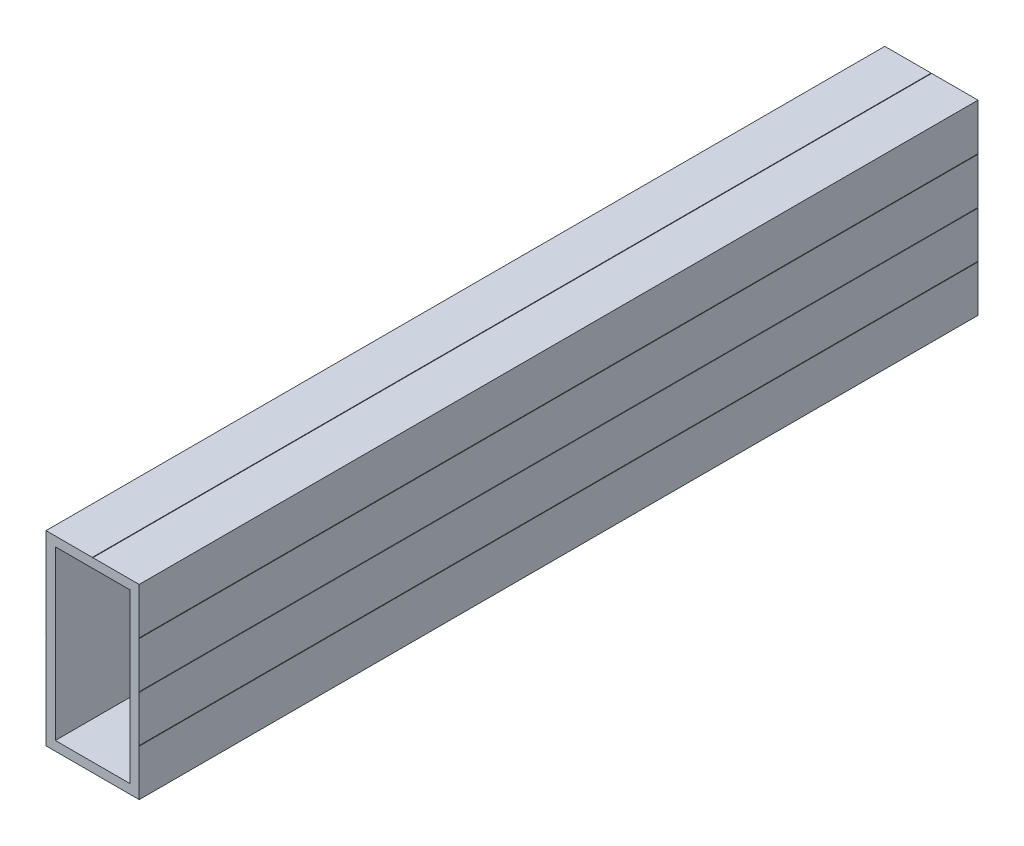
ISO-10303-21;
HEADER;
FILE_DESCRIPTION(('STEP AP214'),'2;1');
FILE_NAME('part.step','',(''),(''),'','','');
FILE_SCHEMA(('AUTOMOTIVE_DESIGN { 1 0 10303 214 1 1 1 1 }'));
ENDSEC;
DATA;
#1=APPLICATION_CONTEXT('core data for automotive mechanical design processes');
#2=APPLICATION_PROTOCOL_DEFINITION('international standard','automotive_design',2000,#1);
#3=PRODUCT_CONTEXT('',#1,'mechanical');
#4=PRODUCT('Part','Part','',(#3));
#5=PRODUCT_RELATED_PRODUCT_CATEGORY('part','',(#4));
#6=PRODUCT_DEFINITION_FORMATION('','',#4);
#7=PRODUCT_DEFINITION_CONTEXT('part definition',#1,'design');
#8=PRODUCT_DEFINITION('design','',#6,#7);
#9=PRODUCT_DEFINITION_SHAPE('','',#8);
#10=(LENGTH_UNIT() NAMED_UNIT(*) SI_UNIT(.MILLI.,.METRE.));
#11=(NAMED_UNIT(*) PLANE_ANGLE_UNIT() SI_UNIT($,.RADIAN.));
#12=(NAMED_UNIT(*) SI_UNIT($,.STERADIAN.) SOLID_ANGLE_UNIT());
#13=UNCERTAINTY_MEASURE_WITH_UNIT(LENGTH_MEASURE(1.E-05),#10,'distance_accuracy_value','');
#14=(GEOMETRIC_REPRESENTATION_CONTEXT(3) GLOBAL_UNCERTAINTY_ASSIGNED_CONTEXT((#13)) GLOBAL_UNIT_ASSIGNED_CONTEXT((#10,
#11,#12)) REPRESENTATION_CONTEXT('',''));
#15=CARTESIAN_POINT('',(0.,0.,0.));
#16=DIRECTION('',(0.,0.,1.));
#17=DIRECTION('',(1.,0.,0.));
#18=AXIS2_PLACEMENT_3D('',#15,#16,#17);
#19=CARTESIAN_POINT('',(-12.7,0.,0.));
#20=DIRECTION('',(1.,0.,0.));
#21=DIRECTION('',(0.,0.,-1.));
#22=AXIS2_PLACEMENT_3D('',#19,#20,#21);
#23=PLANE('',#22);
#24=DIRECTION('',(0.,0.,1.));
#25=VECTOR('',#24,1.);
#26=CARTESIAN_POINT('',(-12.7,25.4,-749.3));
#27=LINE('',#26,#25);
#28=CARTESIAN_POINT('',(-12.7,25.4,520.7));
#29=VERTEX_POINT('',#28);
#30=CARTESIAN_POINT('',(-12.7,25.4,749.3));
#31=VERTEX_POINT('',#30);
#32=EDGE_CURVE('E336',#29,#31,#27,.T.);
#33=ORIENTED_EDGE('',*,*,#32,.F.);
#34=DIRECTION('',(0.,-1.,0.));
#35=VECTOR('',#34,1.);
#36=CARTESIAN_POINT('',(-12.7,0.,520.7));
#37=LINE('',#36,#35);
#38=CARTESIAN_POINT('',(-12.7000000000132,12.7762,520.7));
#39=VERTEX_POINT('',#38);
#40=EDGE_CURVE('E409',#29,#39,#37,.T.);
#41=ORIENTED_EDGE('',*,*,#40,.T.);
#42=DIRECTION('',(0.,0.,1.));
#43=VECTOR('',#42,1.);
#44=CARTESIAN_POINT('',(-12.7000000000132,12.7762,-749.3));
#45=LINE('',#44,#43);
#46=CARTESIAN_POINT('',(-12.7000000000132,12.7762,749.3));
#47=VERTEX_POINT('',#46);
#48=EDGE_CURVE('E272',#39,#47,#45,.T.);
#49=ORIENTED_EDGE('',*,*,#48,.T.);
#50=DIRECTION('',(0.,-1.,0.));
#51=VECTOR('',#50,1.);
#52=CARTESIAN_POINT('',(-12.7,25.4,749.3));
#53=LINE('',#52,#51);
#54=EDGE_CURVE('E340',#31,#47,#53,.T.);
#55=ORIENTED_EDGE('',*,*,#54,.F.);
#56=EDGE_LOOP('',(#33,#41,#49,#55));
#57=FACE_BOUND('',#56,.T.);
#58=ADVANCED_FACE('F35',(#57),#23,.F.);
#59=DIRECTION('',(0.,0.,-1.));
#60=VECTOR('',#59,1.);
#61=CARTESIAN_POINT('',(-12.7,12.6238000000132,0.));
#62=LINE('',#61,#60);
#63=CARTESIAN_POINT('',(-12.7,12.6238000000132,520.7));
#64=VERTEX_POINT('',#63);
#65=CARTESIAN_POINT('',(-12.7,12.6238000000132,749.3));
#66=VERTEX_POINT('',#65);
#67=EDGE_CURVE('E274',#64,#66,#62,.F.);
#68=ORIENTED_EDGE('',*,*,#67,.F.);
#69=DIRECTION('',(0.,-1.,0.));
#70=VECTOR('',#69,1.);
#71=CARTESIAN_POINT('',(-12.7,0.,520.7));
#72=LINE('',#71,#70);
#73=CARTESIAN_POINT('',(-12.7,0.0761999999999976,520.7));
#74=VERTEX_POINT('',#73);
#75=EDGE_CURVE('E50',#64,#74,#72,.T.);
#76=ORIENTED_EDGE('',*,*,#75,.T.);
#77=DIRECTION('',(0.,0.,1.));
#78=VECTOR('',#77,1.);
#79=CARTESIAN_POINT('',(-12.7,0.0761999999999976,-749.3));
#80=LINE('',#79,#78);
#81=CARTESIAN_POINT('',(-12.7,0.0761999999999976,749.3));
#82=VERTEX_POINT('',#81);
#83=EDGE_CURVE('E280',#74,#82,#80,.T.);
#84=ORIENTED_EDGE('',*,*,#83,.T.);
#85=EDGE_CURVE('E344',#66,#82,#53,.T.);
#86=ORIENTED_EDGE('',*,*,#85,.F.);
#87=EDGE_LOOP('',(#68,#76,#84,#86));
#88=FACE_BOUND('',#87,.T.);
#89=ADVANCED_FACE('F514',(#88),#23,.F.);
#90=DIRECTION('',(0.,0.,-1.));
#91=VECTOR('',#90,1.);
#92=CARTESIAN_POINT('',(-12.7,-0.0761999999999985,0.));
#93=LINE('',#92,#91);
#94=CARTESIAN_POINT('',(-12.7,-0.0761999999999982,520.7));
#95=VERTEX_POINT('',#94);
#96=CARTESIAN_POINT('',(-12.7,-0.0761999999999985,749.3));
#97=VERTEX_POINT('',#96);
#98=EDGE_CURVE('E282',#95,#97,#93,.F.);
#99=ORIENTED_EDGE('',*,*,#98,.F.);
#100=DIRECTION('',(0.,-1.,0.));
#101=VECTOR('',#100,1.);
#102=CARTESIAN_POINT('',(-12.7,0.,520.7));
#103=LINE('',#102,#101);
#104=CARTESIAN_POINT('',(-12.7,-12.6238,520.7));
#105=VERTEX_POINT('',#104);
#106=EDGE_CURVE('E431',#95,#105,#103,.T.);
#107=ORIENTED_EDGE('',*,*,#106,.T.);
#108=DIRECTION('',(0.,0.,1.));
#109=VECTOR('',#108,1.);
#110=CARTESIAN_POINT('',(-12.7,-12.6238,-749.3));
#111=LINE('',#110,#109);
#112=CARTESIAN_POINT('',(-12.7,-12.6238,749.3));
#113=VERTEX_POINT('',#112);
#114=EDGE_CURVE('E291',#105,#113,#111,.T.);
#115=ORIENTED_EDGE('',*,*,#114,.T.);
#116=EDGE_CURVE('E597',#97,#113,#53,.T.);
#117=ORIENTED_EDGE('',*,*,#116,.F.);
#118=EDGE_LOOP('',(#99,#107,#115,#117));
#119=FACE_BOUND('',#118,.T.);
#120=ADVANCED_FACE('F506',(#119),#23,.F.);
#121=CARTESIAN_POINT('',(-12.7,-25.4,749.3));
#122=DIRECTION('',(0.,-1.,0.));
#123=DIRECTION('',(0.,0.,-1.));
#124=AXIS2_PLACEMENT_3D('',#121,#122,#123);
#125=PLANE('',#124);
#126=DIRECTION('',(-1.,0.,0.));
#127=VECTOR('',#126,1.);
#128=CARTESIAN_POINT('',(-12.7,-25.4,520.7));
#129=LINE('',#128,#127);
#130=CARTESIAN_POINT('',(-0.0762000000000089,-25.4,520.7));
#131=VERTEX_POINT('',#130);
#132=CARTESIAN_POINT('',(-12.7,-25.4,520.7));
#133=VERTEX_POINT('',#132);
#134=EDGE_CURVE('E453',#131,#133,#129,.T.);
#135=ORIENTED_EDGE('',*,*,#134,.F.);
#136=DIRECTION('',(0.,0.,1.));
#137=VECTOR('',#136,1.);
#138=CARTESIAN_POINT('',(-0.0762000000000087,-25.4,-749.3));
#139=LINE('',#138,#137);
#140=CARTESIAN_POINT('',(-0.0762000000000087,-25.4,749.3));
#141=VERTEX_POINT('',#140);
#142=EDGE_CURVE('E297',#131,#141,#139,.T.);
#143=ORIENTED_EDGE('',*,*,#142,.T.);
#144=DIRECTION('',(1.,0.,0.));
#145=VECTOR('',#144,1.);
#146=CARTESIAN_POINT('',(-12.7,-25.4,749.3));
#147=LINE('',#146,#145);
#148=CARTESIAN_POINT('',(-12.7,-25.4,749.3));
#149=VERTEX_POINT('',#148);
#150=EDGE_CURVE('E43',#149,#141,#147,.T.);
#151=ORIENTED_EDGE('',*,*,#150,.F.);
#152=DIRECTION('',(0.,0.,-1.));
#153=VECTOR('',#152,1.);
#154=CARTESIAN_POINT('',(-12.7,-25.4,749.3));
#155=LINE('',#154,#153);
#156=EDGE_CURVE('E343',#149,#133,#155,.T.);
#157=ORIENTED_EDGE('',*,*,#156,.T.);
#158=EDGE_LOOP('',(#135,#143,#151,#157));
#159=FACE_BOUND('',#158,.T.);
#160=ADVANCED_FACE('F511',(#159),#125,.T.);
#161=CARTESIAN_POINT('',(12.7,0.,0.));
#162=DIRECTION('',(1.,0.,0.));
#163=DIRECTION('',(0.,0.,-1.));
#164=AXIS2_PLACEMENT_3D('',#161,#162,#163);
#165=PLANE('',#164);
#166=DIRECTION('',(0.,-1.,0.));
#167=VECTOR('',#166,1.);
#168=CARTESIAN_POINT('',(12.7,0.,520.7));
#169=LINE('',#168,#167);
#170=CARTESIAN_POINT('',(12.7,-12.7762,520.7));
#171=VERTEX_POINT('',#170);
#172=CARTESIAN_POINT('',(12.7,-25.4,520.7));
#173=VERTEX_POINT('',#172);
#174=EDGE_CURVE('E477',#171,#173,#169,.T.);
#175=ORIENTED_EDGE('',*,*,#174,.F.);
#176=DIRECTION('',(0.,0.,1.));
#177=VECTOR('',#176,1.);
#178=CARTESIAN_POINT('',(12.7,-12.7762,-749.3));
#179=LINE('',#178,#177);
#180=CARTESIAN_POINT('',(12.7,-12.7762,749.3));
#181=VERTEX_POINT('',#180);
#182=EDGE_CURVE('E306',#171,#181,#179,.T.);
#183=ORIENTED_EDGE('',*,*,#182,.T.);
#184=DIRECTION('',(0.,-1.,0.));
#185=VECTOR('',#184,1.);
#186=CARTESIAN_POINT('',(12.7,25.4,749.3));
#187=LINE('',#186,#185);
#188=CARTESIAN_POINT('',(12.7,-25.4,749.3));
#189=VERTEX_POINT('',#188);
#190=EDGE_CURVE('E350',#181,#189,#187,.T.);
#191=ORIENTED_EDGE('',*,*,#190,.T.);
#192=DIRECTION('',(0.,0.,-1.));
#193=VECTOR('',#192,1.);
#194=CARTESIAN_POINT('',(12.7,-25.4,749.3));
#195=LINE('',#194,#193);
#196=EDGE_CURVE('E339',#189,#173,#195,.T.);
#197=ORIENTED_EDGE('',*,*,#196,.T.);
#198=EDGE_LOOP('',(#175,#183,#191,#197));
#199=FACE_BOUND('',#198,.T.);
#200=ADVANCED_FACE('F526',(#199),#165,.T.);
#201=DIRECTION('',(0.,-1.,0.));
#202=VECTOR('',#201,1.);
#203=CARTESIAN_POINT('',(12.7,0.,520.7));
#204=LINE('',#203,#202);
#205=CARTESIAN_POINT('',(12.7,-0.0762000000000003,520.7));
#206=VERTEX_POINT('',#205);
#207=CARTESIAN_POINT('',(12.7,-12.6238,520.7));
#208=VERTEX_POINT('',#207);
#209=EDGE_CURVE('E464',#206,#208,#204,.T.);
#210=ORIENTED_EDGE('',*,*,#209,.F.);
#211=DIRECTION('',(0.,0.,1.));
#212=VECTOR('',#211,1.);
#213=CARTESIAN_POINT('',(12.7,-0.0762000000000003,-749.3));
#214=LINE('',#213,#212);
#215=CARTESIAN_POINT('',(12.7,-0.0762000000000003,749.3));
#216=VERTEX_POINT('',#215);
#217=EDGE_CURVE('E314',#206,#216,#214,.T.);
#218=ORIENTED_EDGE('',*,*,#217,.T.);
#219=CARTESIAN_POINT('',(12.7,-12.6238,749.3));
#220=VERTEX_POINT('',#219);
#221=EDGE_CURVE('E558',#216,#220,#187,.T.);
#222=ORIENTED_EDGE('',*,*,#221,.T.);
#223=DIRECTION('',(0.,0.,-1.));
#224=VECTOR('',#223,1.);
#225=CARTESIAN_POINT('',(12.7,-12.6238,0.));
#226=LINE('',#225,#224);
#227=EDGE_CURVE('E308',#208,#220,#226,.F.);
#228=ORIENTED_EDGE('',*,*,#227,.F.);
#229=EDGE_LOOP('',(#210,#218,#222,#228));
#230=FACE_BOUND('',#229,.T.);
#231=ADVANCED_FACE('F535',(#230),#165,.T.);
#232=DIRECTION('',(0.,-1.,0.));
#233=VECTOR('',#232,1.);
#234=CARTESIAN_POINT('',(12.7,0.,520.7));
#235=LINE('',#234,#233);
#236=CARTESIAN_POINT('',(12.6999999999868,12.6238,520.7));
#237=VERTEX_POINT('',#236);
#238=CARTESIAN_POINT('',(12.7,0.0761999999999985,520.7));
#239=VERTEX_POINT('',#238);
#240=EDGE_CURVE('E451',#237,#239,#235,.T.);
#241=ORIENTED_EDGE('',*,*,#240,.F.);
#242=DIRECTION('',(0.,0.,1.));
#243=VECTOR('',#242,1.);
#244=CARTESIAN_POINT('',(12.6999999999868,12.6238,-749.3));
#245=LINE('',#244,#243);
#246=CARTESIAN_POINT('',(12.6999999999868,12.6238,749.3));
#247=VERTEX_POINT('',#246);
#248=EDGE_CURVE('E325',#237,#247,#245,.T.);
#249=ORIENTED_EDGE('',*,*,#248,.T.);
#250=CARTESIAN_POINT('',(12.7,0.0761999999999985,749.3));
#251=VERTEX_POINT('',#250);
#252=EDGE_CURVE('E354',#247,#251,#187,.T.);
#253=ORIENTED_EDGE('',*,*,#252,.T.);
#254=DIRECTION('',(0.,0.,-1.));
#255=VECTOR('',#254,1.);
#256=CARTESIAN_POINT('',(12.7,0.0761999999999985,0.));
#257=LINE('',#256,#255);
#258=EDGE_CURVE('E316',#239,#251,#257,.F.);
#259=ORIENTED_EDGE('',*,*,#258,.F.);
#260=EDGE_LOOP('',(#241,#249,#253,#259));
#261=FACE_BOUND('',#260,.T.);
#262=ADVANCED_FACE('F527',(#261),#165,.T.);
#263=CARTESIAN_POINT('',(-12.7,25.4,-749.3));
#264=DIRECTION('',(0.,1.,0.));
#265=DIRECTION('',(0.,0.,1.));
#266=AXIS2_PLACEMENT_3D('',#263,#264,#265);
#267=PLANE('',#266);
#268=DIRECTION('',(1.,0.,0.));
#269=VECTOR('',#268,1.);
#270=CARTESIAN_POINT('',(-12.7,25.4,520.7));
#271=LINE('',#270,#269);
#272=CARTESIAN_POINT('',(0.0761999999999968,25.4,520.7));
#273=VERTEX_POINT('',#272);
#274=CARTESIAN_POINT('',(12.7,25.4,520.7));
#275=VERTEX_POINT('',#274);
#276=EDGE_CURVE('E429',#273,#275,#271,.T.);
#277=ORIENTED_EDGE('',*,*,#276,.F.);
#278=DIRECTION('',(0.,0.,1.));
#279=VECTOR('',#278,1.);
#280=CARTESIAN_POINT('',(0.0761999999999968,25.4,-749.3));
#281=LINE('',#280,#279);
#282=CARTESIAN_POINT('',(0.0761999999999968,25.4,749.3));
#283=VERTEX_POINT('',#282);
#284=EDGE_CURVE('E330',#273,#283,#281,.T.);
#285=ORIENTED_EDGE('',*,*,#284,.T.);
#286=DIRECTION('',(1.,0.,0.));
#287=VECTOR('',#286,1.);
#288=CARTESIAN_POINT('',(-12.7,25.4,749.3));
#289=LINE('',#288,#287);
#290=CARTESIAN_POINT('',(12.7,25.4,749.3));
#291=VERTEX_POINT('',#290);
#292=EDGE_CURVE('E347',#283,#291,#289,.T.);
#293=ORIENTED_EDGE('',*,*,#292,.T.);
#294=DIRECTION('',(0.,0.,1.));
#295=VECTOR('',#294,1.);
#296=CARTESIAN_POINT('',(12.7,25.4,-749.3));
#297=LINE('',#296,#295);
#298=EDGE_CURVE('E348',#275,#291,#297,.T.);
#299=ORIENTED_EDGE('',*,*,#298,.F.);
#300=EDGE_LOOP('',(#277,#285,#293,#299));
#301=FACE_BOUND('',#300,.T.);
#302=ADVANCED_FACE('F538',(#301),#267,.T.);
#303=DIRECTION('',(1.,0.,0.));
#304=VECTOR('',#303,1.);
#305=CARTESIAN_POINT('',(-12.7,25.4,520.7));
#306=LINE('',#305,#304);
#307=CARTESIAN_POINT('',(-0.0761999999999985,25.4,520.7));
#308=VERTEX_POINT('',#307);
#309=EDGE_CURVE('E414',#29,#308,#306,.T.);
#310=ORIENTED_EDGE('',*,*,#309,.F.);
#311=ORIENTED_EDGE('',*,*,#32,.T.);
#312=CARTESIAN_POINT('',(-0.0761999999999985,25.4,749.3));
#313=VERTEX_POINT('',#312);
#314=EDGE_CURVE('E360',#31,#313,#289,.T.);
#315=ORIENTED_EDGE('',*,*,#314,.T.);
#316=DIRECTION('',(0.,0.,1.));
#317=VECTOR('',#316,1.);
#318=CARTESIAN_POINT('',(-0.0761999999999985,25.4,-749.3));
#319=LINE('',#318,#317);
#320=EDGE_CURVE('E332',#308,#313,#319,.T.);
#321=ORIENTED_EDGE('',*,*,#320,.F.);
#322=EDGE_LOOP('',(#310,#311,#315,#321));
#323=FACE_BOUND('',#322,.T.);
#324=ADVANCED_FACE('F508',(#323),#267,.T.);
#325=DIRECTION('',(-1.,0.,0.));
#326=VECTOR('',#325,1.);
#327=CARTESIAN_POINT('',(-12.7,-25.4,520.7));
#328=LINE('',#327,#326);
#329=CARTESIAN_POINT('',(0.0761999999999916,-25.4,520.7));
#330=VERTEX_POINT('',#329);
#331=EDGE_CURVE('E475',#173,#330,#328,.T.);
#332=ORIENTED_EDGE('',*,*,#331,.F.);
#333=ORIENTED_EDGE('',*,*,#196,.F.);
#334=CARTESIAN_POINT('',(0.0761999999999898,-25.4,749.3));
#335=VERTEX_POINT('',#334);
#336=EDGE_CURVE('E359',#335,#189,#147,.T.);
#337=ORIENTED_EDGE('',*,*,#336,.F.);
#338=DIRECTION('',(0.,0.,1.));
#339=VECTOR('',#338,1.);
#340=CARTESIAN_POINT('',(0.0761999999999916,-25.4,-749.3));
#341=LINE('',#340,#339);
#342=EDGE_CURVE('E301',#330,#335,#341,.T.);
#343=ORIENTED_EDGE('',*,*,#342,.F.);
#344=EDGE_LOOP('',(#332,#333,#337,#343));
#345=FACE_BOUND('',#344,.T.);
#346=ADVANCED_FACE('F496',(#345),#125,.T.);
#347=CARTESIAN_POINT('',(-12.7,25.4,749.3));
#348=DIRECTION('',(0.,0.,1.));
#349=DIRECTION('',(1.,0.,0.));
#350=AXIS2_PLACEMENT_3D('',#347,#348,#349);
#351=PLANE('',#350);
#352=DIRECTION('',(1.,0.,0.));
#353=VECTOR('',#352,1.);
#354=CARTESIAN_POINT('',(-10.16,-22.86,749.3));
#355=LINE('',#354,#353);
#356=CARTESIAN_POINT('',(-10.16,-22.86,749.3));
#357=VERTEX_POINT('',#356);
#358=CARTESIAN_POINT('',(10.16,-22.86,749.3));
#359=VERTEX_POINT('',#358);
#360=EDGE_CURVE('E479',#357,#359,#355,.T.);
#361=ORIENTED_EDGE('',*,*,#360,.F.);
#362=DIRECTION('',(0.,-1.,0.));
#363=VECTOR('',#362,1.);
#364=CARTESIAN_POINT('',(-10.16,22.86,749.3));
#365=LINE('',#364,#363);
#366=CARTESIAN_POINT('',(-10.16,22.86,749.3));
#367=VERTEX_POINT('',#366);
#368=EDGE_CURVE('E264',#367,#357,#365,.T.);
#369=ORIENTED_EDGE('',*,*,#368,.F.);
#370=DIRECTION('',(-1.,0.,0.));
#371=VECTOR('',#370,1.);
#372=CARTESIAN_POINT('',(10.16,22.86,749.3));
#373=LINE('',#372,#371);
#374=CARTESIAN_POINT('',(10.16,22.86,749.3));
#375=VERTEX_POINT('',#374);
#376=EDGE_CURVE('E483',#375,#367,#373,.T.);
#377=ORIENTED_EDGE('',*,*,#376,.F.);
#378=DIRECTION('',(0.,1.,0.));
#379=VECTOR('',#378,1.);
#380=CARTESIAN_POINT('',(10.16,-22.86,749.3));
#381=LINE('',#380,#379);
#382=EDGE_CURVE('E258',#359,#375,#381,.T.);
#383=ORIENTED_EDGE('',*,*,#382,.F.);
#384=EDGE_LOOP('',(#361,#369,#377,#383));
#385=FACE_BOUND('',#384,.T.);
#386=DIRECTION('',(-0.707106781186539,0.707106781186555,0.));
#387=VECTOR('',#386,1.);
#388=CARTESIAN_POINT('',(-12.5476000000263,12.6238000000132,749.3));
#389=LINE('',#388,#387);
#390=CARTESIAN_POINT('',(-12.6238000000066,12.6999999999934,749.3));
#391=VERTEX_POINT('',#390);
#392=EDGE_CURVE('E268',#391,#47,#389,.T.);
#393=ORIENTED_EDGE('',*,*,#392,.F.);
#394=DIRECTION('',(-0.707106781247692,-0.707106781125403,0.));
#395=VECTOR('',#394,1.);
#396=CARTESIAN_POINT('',(-6.3119000000066,19.0118999989018,749.3));
#397=LINE('',#396,#395);
#398=EDGE_CURVE('E271',#66,#391,#397,.F.);
#399=ORIENTED_EDGE('',*,*,#398,.F.);
#400=ORIENTED_EDGE('',*,*,#85,.T.);
#401=DIRECTION('',(-1.,0.,0.));
#402=VECTOR('',#401,1.);
#403=CARTESIAN_POINT('',(-12.5476,0.0761999999999985,749.3));
#404=LINE('',#403,#402);
#405=CARTESIAN_POINT('',(-12.5475999999737,0.0761999999999985,749.3));
#406=VERTEX_POINT('',#405);
#407=EDGE_CURVE('E275',#406,#82,#404,.T.);
#408=ORIENTED_EDGE('',*,*,#407,.F.);
#409=DIRECTION('',(-0.707106781247692,-0.707106781125403,0.));
#410=VECTOR('',#409,1.);
#411=CARTESIAN_POINT('',(0.0380999999999923,12.661899997797,749.3));
#412=LINE('',#411,#410);
#413=EDGE_CURVE('E278',#97,#406,#412,.F.);
#414=ORIENTED_EDGE('',*,*,#413,.F.);
#415=ORIENTED_EDGE('',*,*,#116,.T.);
#416=DIRECTION('',(-0.707106781186551,0.707106781186543,0.));
#417=VECTOR('',#416,1.);
#418=CARTESIAN_POINT('',(-12.5476,-12.7762,749.3));
#419=LINE('',#418,#417);
#420=CARTESIAN_POINT('',(-12.6238,-12.7,749.3));
#421=VERTEX_POINT('',#420);
#422=EDGE_CURVE('E283',#421,#113,#419,.T.);
#423=ORIENTED_EDGE('',*,*,#422,.F.);
#424=DIRECTION('',(-0.707106781186537,-0.707106781186558,0.));
#425=VECTOR('',#424,1.);
#426=CARTESIAN_POINT('',(6.38809999999999,6.31190000000056,749.3));
#427=LINE('',#426,#425);
#428=CARTESIAN_POINT('',(-12.7,-12.7762,749.3));
#429=VERTEX_POINT('',#428);
#430=EDGE_CURVE('E286',#429,#421,#427,.F.);
#431=ORIENTED_EDGE('',*,*,#430,.F.);
#432=EDGE_CURVE('E338',#429,#149,#53,.T.);
#433=ORIENTED_EDGE('',*,*,#432,.T.);
#434=ORIENTED_EDGE('',*,*,#150,.T.);
#435=DIRECTION('',(0.707106781186552,0.707106781186544,0.));
#436=VECTOR('',#435,1.);
#437=CARTESIAN_POINT('',(19.0118999999999,-6.31190000000029,749.3));
#438=LINE('',#437,#436);
#439=CARTESIAN_POINT('',(0.,-25.3238,749.3));
#440=VERTEX_POINT('',#439);
#441=EDGE_CURVE('E296',#440,#141,#438,.F.);
#442=ORIENTED_EDGE('',*,*,#441,.F.);
#443=DIRECTION('',(-0.707106781186547,0.707106781186548,0.));
#444=VECTOR('',#443,1.);
#445=CARTESIAN_POINT('',(0.0761999999999916,-25.4,749.3));
#446=LINE('',#445,#444);
#447=EDGE_CURVE('E293',#335,#440,#446,.T.);
#448=ORIENTED_EDGE('',*,*,#447,.F.);
#449=ORIENTED_EDGE('',*,*,#336,.T.);
#450=ORIENTED_EDGE('',*,*,#190,.F.);
#451=DIRECTION('',(0.707106781186539,-0.707106781186556,0.));
#452=VECTOR('',#451,1.);
#453=CARTESIAN_POINT('',(12.5476,-12.6238,749.3));
#454=LINE('',#453,#452);
#455=CARTESIAN_POINT('',(12.6238,-12.7,749.3));
#456=VERTEX_POINT('',#455);
#457=EDGE_CURVE('E299',#456,#181,#454,.T.);
#458=ORIENTED_EDGE('',*,*,#457,.F.);
#459=DIRECTION('',(0.707106781186553,0.707106781186542,0.));
#460=VECTOR('',#459,1.);
#461=CARTESIAN_POINT('',(19.0118999999998,-6.3119000000003,749.3));
#462=LINE('',#461,#460);
#463=EDGE_CURVE('E305',#220,#456,#462,.F.);
#464=ORIENTED_EDGE('',*,*,#463,.F.);
#465=ORIENTED_EDGE('',*,*,#221,.F.);
#466=DIRECTION('',(1.,0.,0.));
#467=VECTOR('',#466,1.);
#468=CARTESIAN_POINT('',(12.5476,-0.0761999999999985,749.3));
#469=LINE('',#468,#467);
#470=CARTESIAN_POINT('',(12.5476,-0.0761999999999985,749.3));
#471=VERTEX_POINT('',#470);
#472=EDGE_CURVE('E309',#471,#216,#469,.T.);
#473=ORIENTED_EDGE('',*,*,#472,.F.);
#474=DIRECTION('',(0.707106781186553,0.707106781186542,0.));
#475=VECTOR('',#474,1.);
#476=CARTESIAN_POINT('',(12.6618999999998,0.038099999999798,749.3));
#477=LINE('',#476,#475);
#478=EDGE_CURVE('E312',#251,#471,#477,.F.);
#479=ORIENTED_EDGE('',*,*,#478,.F.);
#480=ORIENTED_EDGE('',*,*,#252,.F.);
#481=DIRECTION('',(0.707106781186544,-0.707106781186552,0.));
#482=VECTOR('',#481,1.);
#483=CARTESIAN_POINT('',(12.5475999999736,12.7762000000132,749.3));
#484=LINE('',#483,#482);
#485=CARTESIAN_POINT('',(12.6237999999868,12.7,749.3));
#486=VERTEX_POINT('',#485);
#487=EDGE_CURVE('E317',#486,#247,#484,.T.);
#488=ORIENTED_EDGE('',*,*,#487,.F.);
#489=DIRECTION('',(0.707106781125415,0.707106781247681,0.));
#490=VECTOR('',#489,1.);
#491=CARTESIAN_POINT('',(6.31190000218278,6.38810000110456,749.3));
#492=LINE('',#491,#490);
#493=CARTESIAN_POINT('',(12.6999999999868,12.7762000000132,749.3));
#494=VERTEX_POINT('',#493);
#495=EDGE_CURVE('E320',#494,#486,#492,.F.);
#496=ORIENTED_EDGE('',*,*,#495,.F.);
#497=EDGE_CURVE('E351',#291,#494,#187,.T.);
#498=ORIENTED_EDGE('',*,*,#497,.F.);
#499=ORIENTED_EDGE('',*,*,#292,.F.);
#500=DIRECTION('',(-0.707106781186552,-0.707106781186543,0.));
#501=VECTOR('',#500,1.);
#502=CARTESIAN_POINT('',(-6.31190000000008,19.0119,749.3));
#503=LINE('',#502,#501);
#504=CARTESIAN_POINT('',(0.,25.3238,749.3));
#505=VERTEX_POINT('',#504);
#506=EDGE_CURVE('E331',#505,#283,#503,.F.);
#507=ORIENTED_EDGE('',*,*,#506,.F.);
#508=DIRECTION('',(0.707106781186548,-0.707106781186547,0.));
#509=VECTOR('',#508,1.);
#510=CARTESIAN_POINT('',(-0.0761999999999985,25.4,749.3));
#511=LINE('',#510,#509);
#512=EDGE_CURVE('E327',#313,#505,#511,.T.);
#513=ORIENTED_EDGE('',*,*,#512,.F.);
#514=ORIENTED_EDGE('',*,*,#314,.F.);
#515=ORIENTED_EDGE('',*,*,#54,.T.);
#516=EDGE_LOOP('',(#393,#399,#400,#408,#414,#415,#423,#431,#433,#434,#442,#448,#449,#450,#458,
#464,#465,#473,#479,#480,#488,#496,#498,#499,#507,#513,#514,#515));
#517=FACE_BOUND('',#516,.T.);
#518=ADVANCED_FACE('F402',(#385,#517),#351,.T.);
#519=DIRECTION('',(0.,0.,1.));
#520=VECTOR('',#519,1.);
#521=CARTESIAN_POINT('',(-12.7,-12.7762,-749.3));
#522=LINE('',#521,#520);
#523=CARTESIAN_POINT('',(-12.7,-12.7762,520.7));
#524=VERTEX_POINT('',#523);
#525=EDGE_CURVE('E288',#524,#429,#522,.T.);
#526=ORIENTED_EDGE('',*,*,#525,.F.);
#527=DIRECTION('',(0.,-1.,0.));
#528=VECTOR('',#527,1.);
#529=CARTESIAN_POINT('',(-12.7,0.,520.7));
#530=LINE('',#529,#528);
#531=EDGE_CURVE('E448',#524,#133,#530,.T.);
#532=ORIENTED_EDGE('',*,*,#531,.T.);
#533=ORIENTED_EDGE('',*,*,#156,.F.);
#534=ORIENTED_EDGE('',*,*,#432,.F.);
#535=EDGE_LOOP('',(#526,#532,#533,#534));
#536=FACE_BOUND('',#535,.T.);
#537=ADVANCED_FACE('F495',(#536),#23,.F.);
#538=DIRECTION('',(0.,-1.,0.));
#539=VECTOR('',#538,1.);
#540=CARTESIAN_POINT('',(12.7,0.,520.7));
#541=LINE('',#540,#539);
#542=CARTESIAN_POINT('',(12.7,12.7762000000132,520.7));
#543=VERTEX_POINT('',#542);
#544=EDGE_CURVE('E437',#275,#543,#541,.T.);
#545=ORIENTED_EDGE('',*,*,#544,.F.);
#546=ORIENTED_EDGE('',*,*,#298,.T.);
#547=ORIENTED_EDGE('',*,*,#497,.T.);
#548=DIRECTION('',(0.,0.,1.));
#549=VECTOR('',#548,1.);
#550=CARTESIAN_POINT('',(12.6999999999868,12.7762000000132,-749.3));
#551=LINE('',#550,#549);
#552=EDGE_CURVE('E322',#543,#494,#551,.T.);
#553=ORIENTED_EDGE('',*,*,#552,.F.);
#554=EDGE_LOOP('',(#545,#546,#547,#553));
#555=FACE_BOUND('',#554,.T.);
#556=ADVANCED_FACE('F503',(#555),#165,.T.);
#557=CARTESIAN_POINT('',(0.0761999999999968,25.4,-749.3));
#558=DIRECTION('',(-0.707106781186543,0.707106781186552,0.));
#559=DIRECTION('',(-0.707106781186552,-0.707106781186543,0.));
#560=AXIS2_PLACEMENT_3D('',#557,#558,#559);
#561=PLANE('',#560);
#562=ORIENTED_EDGE('',*,*,#284,.F.);
#563=DIRECTION('',(0.707106781186552,0.707106781186543,0.));
#564=VECTOR('',#563,1.);
#565=CARTESIAN_POINT('',(0.0761999999999968,25.4,520.7));
#566=LINE('',#565,#564);
#567=CARTESIAN_POINT('',(0.,25.3238,520.7));
#568=VERTEX_POINT('',#567);
#569=EDGE_CURVE('E426',#273,#568,#566,.F.);
#570=ORIENTED_EDGE('',*,*,#569,.T.);
#571=DIRECTION('',(0.,0.,-1.));
#572=VECTOR('',#571,1.);
#573=CARTESIAN_POINT('',(0.,25.3238,-749.3));
#574=LINE('',#573,#572);
#575=EDGE_CURVE('E334',#568,#505,#574,.F.);
#576=ORIENTED_EDGE('',*,*,#575,.T.);
#577=ORIENTED_EDGE('',*,*,#506,.T.);
#578=EDGE_LOOP('',(#562,#570,#576,#577));
#579=FACE_BOUND('',#578,.T.);
#580=ADVANCED_FACE('F524',(#579),#561,.T.);
#581=CARTESIAN_POINT('',(-0.0761999999999985,25.4,-749.3));
#582=DIRECTION('',(-0.707106781186547,-0.707106781186547,0.));
#583=DIRECTION('',(0.707106781186548,-0.707106781186548,0.));
#584=AXIS2_PLACEMENT_3D('',#581,#582,#583);
#585=PLANE('',#584);
#586=ORIENTED_EDGE('',*,*,#575,.F.);
#587=DIRECTION('',(-0.707106781186548,0.707106781186548,0.));
#588=VECTOR('',#587,1.);
#589=CARTESIAN_POINT('',(-0.0761999999999985,25.4,520.7));
#590=LINE('',#589,#588);
#591=EDGE_CURVE('E423',#568,#308,#590,.T.);
#592=ORIENTED_EDGE('',*,*,#591,.T.);
#593=ORIENTED_EDGE('',*,*,#320,.T.);
#594=ORIENTED_EDGE('',*,*,#512,.T.);
#595=EDGE_LOOP('',(#586,#592,#593,#594));
#596=FACE_BOUND('',#595,.T.);
#597=ADVANCED_FACE('F521',(#596),#585,.F.);
#598=CARTESIAN_POINT('',(12.5475999999736,12.7762000000132,-749.3));
#599=DIRECTION('',(-0.707106781186551,-0.707106781186544,0.));
#600=DIRECTION('',(0.707106781186544,-0.707106781186551,0.));
#601=AXIS2_PLACEMENT_3D('',#598,#599,#600);
#602=PLANE('',#601);
#603=ORIENTED_EDGE('',*,*,#248,.F.);
#604=DIRECTION('',(-0.707106781186544,0.707106781186551,0.));
#605=VECTOR('',#604,1.);
#606=CARTESIAN_POINT('',(12.5475999999736,12.7762000000132,520.7));
#607=LINE('',#606,#605);
#608=CARTESIAN_POINT('',(12.6237999999868,12.7,520.7));
#609=VERTEX_POINT('',#608);
#610=EDGE_CURVE('E445',#237,#609,#607,.T.);
#611=ORIENTED_EDGE('',*,*,#610,.T.);
#612=DIRECTION('',(0.,0.,-1.));
#613=VECTOR('',#612,1.);
#614=CARTESIAN_POINT('',(12.6237999999868,12.7,-749.3));
#615=LINE('',#614,#613);
#616=EDGE_CURVE('E324',#609,#486,#615,.F.);
#617=ORIENTED_EDGE('',*,*,#616,.T.);
#618=ORIENTED_EDGE('',*,*,#487,.T.);
#619=EDGE_LOOP('',(#603,#611,#617,#618));
#620=FACE_BOUND('',#619,.T.);
#621=ADVANCED_FACE('F551',(#620),#602,.F.);
#622=CARTESIAN_POINT('',(12.6999999999868,12.7762000000132,-749.3));
#623=DIRECTION('',(0.70710678124768,-0.707106781125414,0.));
#624=DIRECTION('',(0.707106781125415,0.707106781247681,0.));
#625=AXIS2_PLACEMENT_3D('',#622,#623,#624);
#626=PLANE('',#625);
#627=ORIENTED_EDGE('',*,*,#616,.F.);
#628=DIRECTION('',(-0.707106781125415,-0.707106781247681,0.));
#629=VECTOR('',#628,1.);
#630=CARTESIAN_POINT('',(12.6999999999868,12.7762000000132,520.7));
#631=LINE('',#630,#629);
#632=EDGE_CURVE('E442',#609,#543,#631,.F.);
#633=ORIENTED_EDGE('',*,*,#632,.T.);
#634=ORIENTED_EDGE('',*,*,#552,.T.);
#635=ORIENTED_EDGE('',*,*,#495,.T.);
#636=EDGE_LOOP('',(#627,#633,#634,#635));
#637=FACE_BOUND('',#636,.T.);
#638=ADVANCED_FACE('F628',(#637),#626,.T.);
#639=CARTESIAN_POINT('',(12.5476,-0.0761999999999985,-749.3));
#640=DIRECTION('',(0.,-1.,0.));
#641=DIRECTION('',(1.,0.,0.));
#642=AXIS2_PLACEMENT_3D('',#639,#640,#641);
#643=PLANE('',#642);
#644=ORIENTED_EDGE('',*,*,#217,.F.);
#645=DIRECTION('',(-1.,0.,0.));
#646=VECTOR('',#645,1.);
#647=CARTESIAN_POINT('',(12.5476,-0.0761999999999985,520.7));
#648=LINE('',#647,#646);
#649=CARTESIAN_POINT('',(12.5476,-0.0761999999999975,520.7));
#650=VERTEX_POINT('',#649);
#651=EDGE_CURVE('E461',#206,#650,#648,.T.);
#652=ORIENTED_EDGE('',*,*,#651,.T.);
#653=DIRECTION('',(0.,0.,-1.));
#654=VECTOR('',#653,1.);
#655=CARTESIAN_POINT('',(12.5476,-0.0761999999999985,0.));
#656=LINE('',#655,#654);
#657=EDGE_CURVE('E321',#650,#471,#656,.F.);
#658=ORIENTED_EDGE('',*,*,#657,.T.);
#659=ORIENTED_EDGE('',*,*,#472,.T.);
#660=EDGE_LOOP('',(#644,#652,#658,#659));
#661=FACE_BOUND('',#660,.T.);
#662=ADVANCED_FACE('F626',(#661),#643,.F.);
#663=CARTESIAN_POINT('',(12.7,0.0761999999999985,0.));
#664=DIRECTION('',(0.707106781186542,-0.707106781186553,0.));
#665=DIRECTION('',(0.707106781186553,0.707106781186542,0.));
#666=AXIS2_PLACEMENT_3D('',#663,#664,#665);
#667=PLANE('',#666);
#668=ORIENTED_EDGE('',*,*,#657,.F.);
#669=DIRECTION('',(-0.707106781186553,-0.707106781186542,0.));
#670=VECTOR('',#669,1.);
#671=CARTESIAN_POINT('',(12.7,0.0761999999999985,520.7));
#672=LINE('',#671,#670);
#673=EDGE_CURVE('E458',#650,#239,#672,.F.);
#674=ORIENTED_EDGE('',*,*,#673,.T.);
#675=ORIENTED_EDGE('',*,*,#258,.T.);
#676=ORIENTED_EDGE('',*,*,#478,.T.);
#677=EDGE_LOOP('',(#668,#674,#675,#676));
#678=FACE_BOUND('',#677,.T.);
#679=ADVANCED_FACE('F624',(#678),#667,.T.);
#680=CARTESIAN_POINT('',(12.5476,-12.6238,-749.3));
#681=DIRECTION('',(-0.707106781186555,-0.707106781186539,0.));
#682=DIRECTION('',(0.70710678118654,-0.707106781186556,0.));
#683=AXIS2_PLACEMENT_3D('',#680,#681,#682);
#684=PLANE('',#683);
#685=ORIENTED_EDGE('',*,*,#182,.F.);
#686=DIRECTION('',(-0.70710678118654,0.707106781186556,0.));
#687=VECTOR('',#686,1.);
#688=CARTESIAN_POINT('',(12.5476,-12.6238,520.7));
#689=LINE('',#688,#687);
#690=CARTESIAN_POINT('',(12.6238,-12.7,520.7));
#691=VERTEX_POINT('',#690);
#692=EDGE_CURVE('E472',#171,#691,#689,.T.);
#693=ORIENTED_EDGE('',*,*,#692,.T.);
#694=DIRECTION('',(0.,0.,-1.));
#695=VECTOR('',#694,1.);
#696=CARTESIAN_POINT('',(12.6238,-12.7,0.));
#697=LINE('',#696,#695);
#698=EDGE_CURVE('E313',#691,#456,#697,.F.);
#699=ORIENTED_EDGE('',*,*,#698,.T.);
#700=ORIENTED_EDGE('',*,*,#457,.T.);
#701=EDGE_LOOP('',(#685,#693,#699,#700));
#702=FACE_BOUND('',#701,.T.);
#703=ADVANCED_FACE('F620',(#702),#684,.F.);
#704=CARTESIAN_POINT('',(12.7,-12.6238,0.));
#705=DIRECTION('',(0.707106781186542,-0.707106781186553,0.));
#706=DIRECTION('',(0.707106781186553,0.707106781186542,0.));
#707=AXIS2_PLACEMENT_3D('',#704,#705,#706);
#708=PLANE('',#707);
#709=ORIENTED_EDGE('',*,*,#698,.F.);
#710=DIRECTION('',(-0.707106781186553,-0.707106781186542,0.));
#711=VECTOR('',#710,1.);
#712=CARTESIAN_POINT('',(12.7,-12.6238,520.7));
#713=LINE('',#712,#711);
#714=EDGE_CURVE('E469',#691,#208,#713,.F.);
#715=ORIENTED_EDGE('',*,*,#714,.T.);
#716=ORIENTED_EDGE('',*,*,#227,.T.);
#717=ORIENTED_EDGE('',*,*,#463,.T.);
#718=EDGE_LOOP('',(#709,#715,#716,#717));
#719=FACE_BOUND('',#718,.T.);
#720=ADVANCED_FACE('F623',(#719),#708,.T.);
#721=CARTESIAN_POINT('',(-0.0762000000000087,-25.4,-749.3));
#722=DIRECTION('',(0.707106781186543,-0.707106781186551,0.));
#723=DIRECTION('',(0.707106781186552,0.707106781186544,0.));
#724=AXIS2_PLACEMENT_3D('',#721,#722,#723);
#725=PLANE('',#724);
#726=ORIENTED_EDGE('',*,*,#142,.F.);
#727=DIRECTION('',(-0.707106781186552,-0.707106781186544,0.));
#728=VECTOR('',#727,1.);
#729=CARTESIAN_POINT('',(-0.0762000000000087,-25.4,520.7));
#730=LINE('',#729,#728);
#731=CARTESIAN_POINT('',(0.,-25.3238,520.7));
#732=VERTEX_POINT('',#731);
#733=EDGE_CURVE('E455',#131,#732,#730,.F.);
#734=ORIENTED_EDGE('',*,*,#733,.T.);
#735=DIRECTION('',(0.,0.,-1.));
#736=VECTOR('',#735,1.);
#737=CARTESIAN_POINT('',(0.,-25.3238,-749.3));
#738=LINE('',#737,#736);
#739=EDGE_CURVE('E300',#732,#440,#738,.F.);
#740=ORIENTED_EDGE('',*,*,#739,.T.);
#741=ORIENTED_EDGE('',*,*,#441,.T.);
#742=EDGE_LOOP('',(#726,#734,#740,#741));
#743=FACE_BOUND('',#742,.T.);
#744=ADVANCED_FACE('F578',(#743),#725,.T.);
#745=CARTESIAN_POINT('',(0.0761999999999916,-25.4,-749.3));
#746=DIRECTION('',(0.707106781186548,0.707106781186547,0.));
#747=DIRECTION('',(-0.707106781186547,0.707106781186548,0.));
#748=AXIS2_PLACEMENT_3D('',#745,#746,#747);
#749=PLANE('',#748);
#750=ORIENTED_EDGE('',*,*,#739,.F.);
#751=DIRECTION('',(0.707106781186547,-0.707106781186548,0.));
#752=VECTOR('',#751,1.);
#753=CARTESIAN_POINT('',(0.0761999999999916,-25.4,520.7));
#754=LINE('',#753,#752);
#755=EDGE_CURVE('E466',#732,#330,#754,.T.);
#756=ORIENTED_EDGE('',*,*,#755,.T.);
#757=ORIENTED_EDGE('',*,*,#342,.T.);
#758=ORIENTED_EDGE('',*,*,#447,.T.);
#759=EDGE_LOOP('',(#750,#756,#757,#758));
#760=FACE_BOUND('',#759,.T.);
#761=ADVANCED_FACE('F573',(#760),#749,.F.);
#762=CARTESIAN_POINT('',(-12.5476,-12.7762,-749.3));
#763=DIRECTION('',(0.707106781186543,0.707106781186551,0.));
#764=DIRECTION('',(-0.707106781186552,0.707106781186544,0.));
#765=AXIS2_PLACEMENT_3D('',#762,#763,#764);
#766=PLANE('',#765);
#767=ORIENTED_EDGE('',*,*,#114,.F.);
#768=DIRECTION('',(0.707106781186552,-0.707106781186544,0.));
#769=VECTOR('',#768,1.);
#770=CARTESIAN_POINT('',(-12.5476,-12.7762,520.7));
#771=LINE('',#770,#769);
#772=CARTESIAN_POINT('',(-12.6238,-12.7,520.7));
#773=VERTEX_POINT('',#772);
#774=EDGE_CURVE('E434',#105,#773,#771,.T.);
#775=ORIENTED_EDGE('',*,*,#774,.T.);
#776=DIRECTION('',(0.,0.,-1.));
#777=VECTOR('',#776,1.);
#778=CARTESIAN_POINT('',(-12.6238,-12.7,-749.3));
#779=LINE('',#778,#777);
#780=EDGE_CURVE('E290',#773,#421,#779,.F.);
#781=ORIENTED_EDGE('',*,*,#780,.T.);
#782=ORIENTED_EDGE('',*,*,#422,.T.);
#783=EDGE_LOOP('',(#767,#775,#781,#782));
#784=FACE_BOUND('',#783,.T.);
#785=ADVANCED_FACE('F592',(#784),#766,.F.);
#786=CARTESIAN_POINT('',(-12.7,-12.7762,-749.3));
#787=DIRECTION('',(-0.707106781186558,0.707106781186537,0.));
#788=DIRECTION('',(-0.707106781186537,-0.707106781186558,0.));
#789=AXIS2_PLACEMENT_3D('',#786,#787,#788);
#790=PLANE('',#789);
#791=ORIENTED_EDGE('',*,*,#780,.F.);
#792=DIRECTION('',(0.707106781186537,0.707106781186558,0.));
#793=VECTOR('',#792,1.);
#794=CARTESIAN_POINT('',(-12.7,-12.7762,520.7));
#795=LINE('',#794,#793);
#796=EDGE_CURVE('E439',#773,#524,#795,.F.);
#797=ORIENTED_EDGE('',*,*,#796,.T.);
#798=ORIENTED_EDGE('',*,*,#525,.T.);
#799=ORIENTED_EDGE('',*,*,#430,.T.);
#800=EDGE_LOOP('',(#791,#797,#798,#799));
#801=FACE_BOUND('',#800,.T.);
#802=ADVANCED_FACE('F587',(#801),#790,.T.);
#803=CARTESIAN_POINT('',(-12.5476,0.0761999999999985,-749.3));
#804=DIRECTION('',(0.,1.,0.));
#805=DIRECTION('',(-1.,0.,0.));
#806=AXIS2_PLACEMENT_3D('',#803,#804,#805);
#807=PLANE('',#806);
#808=ORIENTED_EDGE('',*,*,#83,.F.);
#809=DIRECTION('',(1.,0.,0.));
#810=VECTOR('',#809,1.);
#811=CARTESIAN_POINT('',(-12.5476,0.0761999999999985,520.7));
#812=LINE('',#811,#810);
#813=CARTESIAN_POINT('',(-12.5475999999737,0.0761999999999985,520.7));
#814=VERTEX_POINT('',#813);
#815=EDGE_CURVE('E411',#74,#814,#812,.T.);
#816=ORIENTED_EDGE('',*,*,#815,.T.);
#817=DIRECTION('',(0.,0.,-1.));
#818=VECTOR('',#817,1.);
#819=CARTESIAN_POINT('',(-12.5475999999737,0.0761999999999985,0.));
#820=LINE('',#819,#818);
#821=EDGE_CURVE('E287',#814,#406,#820,.F.);
#822=ORIENTED_EDGE('',*,*,#821,.T.);
#823=ORIENTED_EDGE('',*,*,#407,.T.);
#824=EDGE_LOOP('',(#808,#816,#822,#823));
#825=FACE_BOUND('',#824,.T.);
#826=ADVANCED_FACE('F605',(#825),#807,.F.);
#827=CARTESIAN_POINT('',(-12.7,-0.0761999999999985,0.));
#828=DIRECTION('',(-0.707106781125403,0.707106781247692,0.));
#829=DIRECTION('',(-0.707106781247692,-0.707106781125403,0.));
#830=AXIS2_PLACEMENT_3D('',#827,#828,#829);
#831=PLANE('',#830);
#832=ORIENTED_EDGE('',*,*,#821,.F.);
#833=DIRECTION('',(0.707106781247692,0.707106781125403,0.));
#834=VECTOR('',#833,1.);
#835=CARTESIAN_POINT('',(-12.7,-0.0761999999999985,520.7));
#836=LINE('',#835,#834);
#837=EDGE_CURVE('E420',#814,#95,#836,.F.);
#838=ORIENTED_EDGE('',*,*,#837,.T.);
#839=ORIENTED_EDGE('',*,*,#98,.T.);
#840=ORIENTED_EDGE('',*,*,#413,.T.);
#841=EDGE_LOOP('',(#832,#838,#839,#840));
#842=FACE_BOUND('',#841,.T.);
#843=ADVANCED_FACE('F601',(#842),#831,.T.);
#844=CARTESIAN_POINT('',(-12.5476000000263,12.6238000000132,-749.3));
#845=DIRECTION('',(0.707106781186556,0.70710678118654,0.));
#846=DIRECTION('',(-0.707106781186539,0.707106781186556,0.));
#847=AXIS2_PLACEMENT_3D('',#844,#845,#846);
#848=PLANE('',#847);
#849=ORIENTED_EDGE('',*,*,#48,.F.);
#850=DIRECTION('',(0.707106781186539,-0.707106781186556,0.));
#851=VECTOR('',#850,1.);
#852=CARTESIAN_POINT('',(-12.5476000000263,12.6238000000132,520.7));
#853=LINE('',#852,#851);
#854=CARTESIAN_POINT('',(-12.6238000000066,12.6999999999934,520.7));
#855=VERTEX_POINT('',#854);
#856=EDGE_CURVE('E395',#39,#855,#853,.T.);
#857=ORIENTED_EDGE('',*,*,#856,.T.);
#858=DIRECTION('',(0.,0.,-1.));
#859=VECTOR('',#858,1.);
#860=CARTESIAN_POINT('',(-12.6238000000066,12.6999999999934,0.));
#861=LINE('',#860,#859);
#862=EDGE_CURVE('E279',#855,#391,#861,.F.);
#863=ORIENTED_EDGE('',*,*,#862,.T.);
#864=ORIENTED_EDGE('',*,*,#392,.T.);
#865=EDGE_LOOP('',(#849,#857,#863,#864));
#866=FACE_BOUND('',#865,.T.);
#867=ADVANCED_FACE('F393',(#866),#848,.F.);
#868=CARTESIAN_POINT('',(-12.7,12.6238000000132,0.));
#869=DIRECTION('',(-0.707106781125403,0.707106781247692,0.));
#870=DIRECTION('',(-0.707106781247692,-0.707106781125403,0.));
#871=AXIS2_PLACEMENT_3D('',#868,#869,#870);
#872=PLANE('',#871);
#873=ORIENTED_EDGE('',*,*,#862,.F.);
#874=DIRECTION('',(0.707106781247692,0.707106781125403,0.));
#875=VECTOR('',#874,1.);
#876=CARTESIAN_POINT('',(-12.7,12.6238000000132,520.7));
#877=LINE('',#876,#875);
#878=EDGE_CURVE('E867',#855,#64,#877,.F.);
#879=ORIENTED_EDGE('',*,*,#878,.T.);
#880=ORIENTED_EDGE('',*,*,#67,.T.);
#881=ORIENTED_EDGE('',*,*,#398,.T.);
#882=EDGE_LOOP('',(#873,#879,#880,#881));
#883=FACE_BOUND('',#882,.T.);
#884=ADVANCED_FACE('F37',(#883),#872,.T.);
#885=CARTESIAN_POINT('',(-10.16,-22.86,-749.3));
#886=DIRECTION('',(0.,-1.,0.));
#887=DIRECTION('',(0.,0.,-1.));
#888=AXIS2_PLACEMENT_3D('',#885,#886,#887);
#889=PLANE('',#888);
#890=DIRECTION('',(0.,0.,1.));
#891=VECTOR('',#890,1.);
#892=CARTESIAN_POINT('',(10.16,-22.86,-749.3));
#893=LINE('',#892,#891);
#894=CARTESIAN_POINT('',(10.16,-22.86,520.7));
#895=VERTEX_POINT('',#894);
#896=EDGE_CURVE('E260',#895,#359,#893,.T.);
#897=ORIENTED_EDGE('',*,*,#896,.F.);
#898=DIRECTION('',(-1.,0.,0.));
#899=VECTOR('',#898,1.);
#900=CARTESIAN_POINT('',(-10.16,-22.86,520.7));
#901=LINE('',#900,#899);
#902=CARTESIAN_POINT('',(-10.16,-22.86,520.7));
#903=VERTEX_POINT('',#902);
#904=EDGE_CURVE('E58',#895,#903,#901,.T.);
#905=ORIENTED_EDGE('',*,*,#904,.T.);
#906=DIRECTION('',(0.,0.,1.));
#907=VECTOR('',#906,1.);
#908=CARTESIAN_POINT('',(-10.16,-22.86,-749.3));
#909=LINE('',#908,#907);
#910=EDGE_CURVE('E262',#903,#357,#909,.T.);
#911=ORIENTED_EDGE('',*,*,#910,.T.);
#912=ORIENTED_EDGE('',*,*,#360,.T.);
#913=EDGE_LOOP('',(#897,#905,#911,#912));
#914=FACE_BOUND('',#913,.T.);
#915=ADVANCED_FACE('F488',(#914),#889,.F.);
#916=CARTESIAN_POINT('',(-10.16,22.86,-749.3));
#917=DIRECTION('',(-1.,0.,0.));
#918=DIRECTION('',(0.,0.,1.));
#919=AXIS2_PLACEMENT_3D('',#916,#917,#918);
#920=PLANE('',#919);
#921=ORIENTED_EDGE('',*,*,#910,.F.);
#922=DIRECTION('',(0.,1.,0.));
#923=VECTOR('',#922,1.);
#924=CARTESIAN_POINT('',(-10.16,22.86,520.7));
#925=LINE('',#924,#923);
#926=CARTESIAN_POINT('',(-10.16,22.86,520.7));
#927=VERTEX_POINT('',#926);
#928=EDGE_CURVE('E254',#903,#927,#925,.T.);
#929=ORIENTED_EDGE('',*,*,#928,.T.);
#930=DIRECTION('',(0.,0.,1.));
#931=VECTOR('',#930,1.);
#932=CARTESIAN_POINT('',(-10.16,22.86,-749.3));
#933=LINE('',#932,#931);
#934=EDGE_CURVE('E253',#927,#367,#933,.T.);
#935=ORIENTED_EDGE('',*,*,#934,.T.);
#936=ORIENTED_EDGE('',*,*,#368,.T.);
#937=EDGE_LOOP('',(#921,#929,#935,#936));
#938=FACE_BOUND('',#937,.T.);
#939=ADVANCED_FACE('F492',(#938),#920,.F.);
#940=CARTESIAN_POINT('',(10.16,22.86,-749.3));
#941=DIRECTION('',(0.,1.,0.));
#942=DIRECTION('',(0.,0.,1.));
#943=AXIS2_PLACEMENT_3D('',#940,#941,#942);
#944=PLANE('',#943);
#945=ORIENTED_EDGE('',*,*,#934,.F.);
#946=DIRECTION('',(1.,0.,0.));
#947=VECTOR('',#946,1.);
#948=CARTESIAN_POINT('',(10.16,22.86,520.7));
#949=LINE('',#948,#947);
#950=CARTESIAN_POINT('',(10.16,22.86,520.7));
#951=VERTEX_POINT('',#950);
#952=EDGE_CURVE('E242',#927,#951,#949,.T.);
#953=ORIENTED_EDGE('',*,*,#952,.T.);
#954=DIRECTION('',(0.,0.,1.));
#955=VECTOR('',#954,1.);
#956=CARTESIAN_POINT('',(10.16,22.86,-749.3));
#957=LINE('',#956,#955);
#958=EDGE_CURVE('E251',#951,#375,#957,.T.);
#959=ORIENTED_EDGE('',*,*,#958,.T.);
#960=ORIENTED_EDGE('',*,*,#376,.T.);
#961=EDGE_LOOP('',(#945,#953,#959,#960));
#962=FACE_BOUND('',#961,.T.);
#963=ADVANCED_FACE('F249',(#962),#944,.F.);
#964=CARTESIAN_POINT('',(10.16,-22.86,-749.3));
#965=DIRECTION('',(1.,0.,0.));
#966=DIRECTION('',(0.,0.,-1.));
#967=AXIS2_PLACEMENT_3D('',#964,#965,#966);
#968=PLANE('',#967);
#969=ORIENTED_EDGE('',*,*,#958,.F.);
#970=DIRECTION('',(0.,-1.,0.));
#971=VECTOR('',#970,1.);
#972=CARTESIAN_POINT('',(10.16,-22.86,520.7));
#973=LINE('',#972,#971);
#974=EDGE_CURVE('E11',#951,#895,#973,.T.);
#975=ORIENTED_EDGE('',*,*,#974,.T.);
#976=ORIENTED_EDGE('',*,*,#896,.T.);
#977=ORIENTED_EDGE('',*,*,#382,.T.);
#978=EDGE_LOOP('',(#969,#975,#976,#977));
#979=FACE_BOUND('',#978,.T.);
#980=ADVANCED_FACE('F256',(#979),#968,.F.);
#981=CARTESIAN_POINT('',(0.,0.,520.7));
#982=DIRECTION('',(0.,0.,1.));
#983=DIRECTION('',(1.,0.,0.));
#984=AXIS2_PLACEMENT_3D('',#981,#982,#983);
#985=PLANE('',#984);
#986=ORIENTED_EDGE('',*,*,#174,.T.);
#987=ORIENTED_EDGE('',*,*,#331,.T.);
#988=ORIENTED_EDGE('',*,*,#755,.F.);
#989=ORIENTED_EDGE('',*,*,#733,.F.);
#990=ORIENTED_EDGE('',*,*,#134,.T.);
#991=ORIENTED_EDGE('',*,*,#531,.F.);
#992=ORIENTED_EDGE('',*,*,#796,.F.);
#993=ORIENTED_EDGE('',*,*,#774,.F.);
#994=ORIENTED_EDGE('',*,*,#106,.F.);
#995=ORIENTED_EDGE('',*,*,#837,.F.);
#996=ORIENTED_EDGE('',*,*,#815,.F.);
#997=ORIENTED_EDGE('',*,*,#75,.F.);
#998=ORIENTED_EDGE('',*,*,#878,.F.);
#999=ORIENTED_EDGE('',*,*,#856,.F.);
#1000=ORIENTED_EDGE('',*,*,#40,.F.);
#1001=ORIENTED_EDGE('',*,*,#309,.T.);
#1002=ORIENTED_EDGE('',*,*,#591,.F.);
#1003=ORIENTED_EDGE('',*,*,#569,.F.);
#1004=ORIENTED_EDGE('',*,*,#276,.T.);
#1005=ORIENTED_EDGE('',*,*,#544,.T.);
#1006=ORIENTED_EDGE('',*,*,#632,.F.);
#1007=ORIENTED_EDGE('',*,*,#610,.F.);
#1008=ORIENTED_EDGE('',*,*,#240,.T.);
#1009=ORIENTED_EDGE('',*,*,#673,.F.);
#1010=ORIENTED_EDGE('',*,*,#651,.F.);
#1011=ORIENTED_EDGE('',*,*,#209,.T.);
#1012=ORIENTED_EDGE('',*,*,#714,.F.);
#1013=ORIENTED_EDGE('',*,*,#692,.F.);
#1014=EDGE_LOOP('',(#986,#987,#988,#989,#990,#991,#992,#993,#994,#995,#996,#997,#998,#999,#1000,
#1001,#1002,#1003,#1004,#1005,#1006,#1007,#1008,#1009,#1010,#1011,#1012,#1013));
#1015=FACE_BOUND('',#1014,.T.);
#1016=ORIENTED_EDGE('',*,*,#974,.F.);
#1017=ORIENTED_EDGE('',*,*,#952,.F.);
#1018=ORIENTED_EDGE('',*,*,#928,.F.);
#1019=ORIENTED_EDGE('',*,*,#904,.F.);
#1020=EDGE_LOOP('',(#1016,#1017,#1018,#1019));
#1021=FACE_BOUND('',#1020,.T.);
#1022=ADVANCED_FACE('F241',(#1015,#1021),#985,.F.);
#1023=CLOSED_SHELL('',(#58,#89,#120,#160,#200,#231,#262,#302,#324,#346,#518,#537,#556,#580,#597,
#621,#638,#662,#679,#703,#720,#744,#761,#785,#802,#826,#843,#867,#884,#915,#939,#963,#980,#1022));
#1024=MANIFOLD_SOLID_BREP('B2',#1023);
#1025=ADVANCED_BREP_SHAPE_REPRESENTATION('',(#18,#1024),#14);
#1026=SHAPE_DEFINITION_REPRESENTATION(#9,#1025);
ENDSEC;
END-ISO-10303-21;
